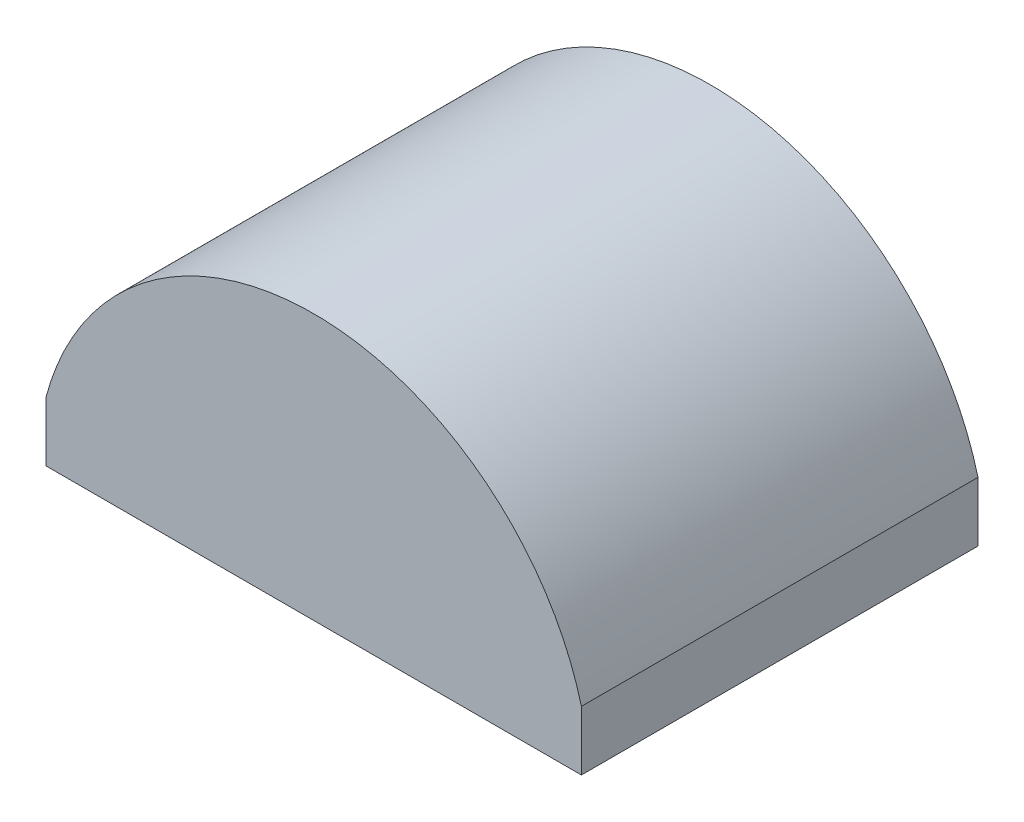
ISO-10303-21;
HEADER;
FILE_DESCRIPTION(('STEP AP214'),'2;1');
FILE_NAME('part.step','',(''),(''),'','','');
FILE_SCHEMA(('AUTOMOTIVE_DESIGN { 1 0 10303 214 1 1 1 1 }'));
ENDSEC;
DATA;
#1=APPLICATION_CONTEXT('core data for automotive mechanical design processes');
#2=APPLICATION_PROTOCOL_DEFINITION('international standard','automotive_design',2000,#1);
#3=PRODUCT_CONTEXT('',#1,'mechanical');
#4=PRODUCT('Part','Part','',(#3));
#5=PRODUCT_RELATED_PRODUCT_CATEGORY('part','',(#4));
#6=PRODUCT_DEFINITION_FORMATION('','',#4);
#7=PRODUCT_DEFINITION_CONTEXT('part definition',#1,'design');
#8=PRODUCT_DEFINITION('design','',#6,#7);
#9=PRODUCT_DEFINITION_SHAPE('','',#8);
#10=(LENGTH_UNIT() NAMED_UNIT(*) SI_UNIT(.MILLI.,.METRE.));
#11=(NAMED_UNIT(*) PLANE_ANGLE_UNIT() SI_UNIT($,.RADIAN.));
#12=(NAMED_UNIT(*) SI_UNIT($,.STERADIAN.) SOLID_ANGLE_UNIT());
#13=UNCERTAINTY_MEASURE_WITH_UNIT(LENGTH_MEASURE(1.E-05),#10,'distance_accuracy_value','');
#14=(GEOMETRIC_REPRESENTATION_CONTEXT(3) GLOBAL_UNCERTAINTY_ASSIGNED_CONTEXT((#13)) GLOBAL_UNIT_ASSIGNED_CONTEXT((#10,
#11,#12)) REPRESENTATION_CONTEXT('',''));
#15=CARTESIAN_POINT('',(0.,0.,0.));
#16=DIRECTION('',(0.,0.,1.));
#17=DIRECTION('',(1.,0.,0.));
#18=AXIS2_PLACEMENT_3D('',#15,#16,#17);
#19=CARTESIAN_POINT('',(0.,0.,10.));
#20=DIRECTION('',(1.,0.,0.));
#21=DIRECTION('',(0.,1.,0.));
#22=AXIS2_PLACEMENT_3D('',#19,#20,#21);
#23=PLANE('',#22);
#24=DIRECTION('',(0.,-1.,0.));
#25=VECTOR('',#24,1.);
#26=CARTESIAN_POINT('',(0.,0.,0.));
#27=LINE('',#26,#25);
#28=CARTESIAN_POINT('',(0.,2.,0.));
#29=VERTEX_POINT('',#28);
#30=CARTESIAN_POINT('',(0.,0.500000000000004,0.));
#31=VERTEX_POINT('',#30);
#32=EDGE_CURVE('E110',#29,#31,#27,.T.);
#33=ORIENTED_EDGE('',*,*,#32,.T.);
#34=DIRECTION('',(0.,0.,1.));
#35=VECTOR('',#34,1.);
#36=CARTESIAN_POINT('',(0.,0.500000000000004,10.));
#37=LINE('',#36,#35);
#38=CARTESIAN_POINT('',(0.,0.500000000000004,10.));
#39=VERTEX_POINT('',#38);
#40=EDGE_CURVE('E128',#31,#39,#37,.T.);
#41=ORIENTED_EDGE('',*,*,#40,.T.);
#42=DIRECTION('',(0.,-1.,0.));
#43=VECTOR('',#42,1.);
#44=CARTESIAN_POINT('',(0.,0.,10.));
#45=LINE('',#44,#43);
#46=CARTESIAN_POINT('',(0.,2.,10.));
#47=VERTEX_POINT('',#46);
#48=EDGE_CURVE('E92',#47,#39,#45,.T.);
#49=ORIENTED_EDGE('',*,*,#48,.F.);
#50=DIRECTION('',(0.,0.,-1.));
#51=VECTOR('',#50,1.);
#52=CARTESIAN_POINT('',(0.,2.,10.));
#53=LINE('',#52,#51);
#54=EDGE_CURVE('E101',#47,#29,#53,.T.);
#55=ORIENTED_EDGE('',*,*,#54,.T.);
#56=EDGE_LOOP('',(#33,#41,#49,#55));
#57=FACE_BOUND('',#56,.T.);
#58=ADVANCED_FACE('F33',(#57),#23,.F.);
#59=CARTESIAN_POINT('',(0.,0.,10.));
#60=DIRECTION('',(0.,1.,0.));
#61=DIRECTION('',(0.,0.,1.));
#62=AXIS2_PLACEMENT_3D('',#59,#60,#61);
#63=PLANE('',#62);
#64=DIRECTION('',(-1.,0.,0.));
#65=VECTOR('',#64,1.);
#66=CARTESIAN_POINT('',(0.,0.,9.5));
#67=LINE('',#66,#65);
#68=CARTESIAN_POINT('',(13.,0.,9.5));
#69=VERTEX_POINT('',#68);
#70=CARTESIAN_POINT('',(0.500000000000003,0.,9.5));
#71=VERTEX_POINT('',#70);
#72=EDGE_CURVE('E123',#69,#71,#67,.T.);
#73=ORIENTED_EDGE('',*,*,#72,.T.);
#74=DIRECTION('',(0.,0.,-1.));
#75=VECTOR('',#74,1.);
#76=CARTESIAN_POINT('',(0.500000000000003,0.,10.));
#77=LINE('',#76,#75);
#78=CARTESIAN_POINT('',(0.500000000000003,0.,0.500000000000002));
#79=VERTEX_POINT('',#78);
#80=EDGE_CURVE('E125',#71,#79,#77,.T.);
#81=ORIENTED_EDGE('',*,*,#80,.T.);
#82=DIRECTION('',(1.,0.,0.));
#83=VECTOR('',#82,1.);
#84=CARTESIAN_POINT('',(13.5,0.,0.500000000000002));
#85=LINE('',#84,#83);
#86=CARTESIAN_POINT('',(13.,0.,0.500000000000002));
#87=VERTEX_POINT('',#86);
#88=EDGE_CURVE('E119',#79,#87,#85,.T.);
#89=ORIENTED_EDGE('',*,*,#88,.T.);
#90=DIRECTION('',(0.,0.,1.));
#91=VECTOR('',#90,1.);
#92=CARTESIAN_POINT('',(13.,0.,10.));
#93=LINE('',#92,#91);
#94=EDGE_CURVE('E121',#87,#69,#93,.T.);
#95=ORIENTED_EDGE('',*,*,#94,.T.);
#96=EDGE_LOOP('',(#73,#81,#89,#95));
#97=FACE_BOUND('',#96,.T.);
#98=CARTESIAN_POINT('',(6.75,0.,5.));
#99=DIRECTION('',(0.,1.,0.));
#100=DIRECTION('',(0.,0.,1.));
#101=AXIS2_PLACEMENT_3D('',#98,#99,#100);
#102=CIRCLE('',#101,4.1);
#103=CARTESIAN_POINT('',(6.75,0.,9.1));
#104=VERTEX_POINT('',#103);
#105=EDGE_CURVE('E100',#104,#104,#102,.T.);
#106=ORIENTED_EDGE('',*,*,#105,.T.);
#107=EDGE_LOOP('',(#106));
#108=FACE_BOUND('',#107,.T.);
#109=ADVANCED_FACE('F162',(#97,#108),#63,.F.);
#110=CARTESIAN_POINT('',(13.5,0.,10.));
#111=DIRECTION('',(-1.,0.,0.));
#112=DIRECTION('',(0.,-1.,0.));
#113=AXIS2_PLACEMENT_3D('',#110,#111,#112);
#114=PLANE('',#113);
#115=DIRECTION('',(0.,1.,0.));
#116=VECTOR('',#115,1.);
#117=CARTESIAN_POINT('',(13.5,0.,10.));
#118=LINE('',#117,#116);
#119=CARTESIAN_POINT('',(13.5,0.500000000000003,10.));
#120=VERTEX_POINT('',#119);
#121=CARTESIAN_POINT('',(13.5,2.,10.));
#122=VERTEX_POINT('',#121);
#123=EDGE_CURVE('E86',#120,#122,#118,.T.);
#124=ORIENTED_EDGE('',*,*,#123,.F.);
#125=DIRECTION('',(0.,0.,-1.));
#126=VECTOR('',#125,1.);
#127=CARTESIAN_POINT('',(13.5,0.500000000000004,10.));
#128=LINE('',#127,#126);
#129=CARTESIAN_POINT('',(13.5,0.500000000000004,0.));
#130=VERTEX_POINT('',#129);
#131=EDGE_CURVE('E50',#120,#130,#128,.T.);
#132=ORIENTED_EDGE('',*,*,#131,.T.);
#133=DIRECTION('',(0.,1.,0.));
#134=VECTOR('',#133,1.);
#135=CARTESIAN_POINT('',(13.5,0.,0.));
#136=LINE('',#135,#134);
#137=CARTESIAN_POINT('',(13.5,2.,0.));
#138=VERTEX_POINT('',#137);
#139=EDGE_CURVE('E97',#130,#138,#136,.T.);
#140=ORIENTED_EDGE('',*,*,#139,.T.);
#141=DIRECTION('',(0.,0.,-1.));
#142=VECTOR('',#141,1.);
#143=CARTESIAN_POINT('',(13.5,2.,10.));
#144=LINE('',#143,#142);
#145=EDGE_CURVE('E95',#122,#138,#144,.T.);
#146=ORIENTED_EDGE('',*,*,#145,.F.);
#147=EDGE_LOOP('',(#124,#132,#140,#146));
#148=FACE_BOUND('',#147,.T.);
#149=ADVANCED_FACE('F96',(#148),#114,.F.);
#150=CARTESIAN_POINT('',(6.75,0.218990384615381,10.));
#151=DIRECTION('',(0.,0.,-1.));
#152=DIRECTION('',(-1.,0.,0.));
#153=AXIS2_PLACEMENT_3D('',#150,#151,#152);
#154=CYLINDRICAL_SURFACE('',#153,6.98100961538462);
#155=CARTESIAN_POINT('',(6.75,0.218990384615381,0.));
#156=DIRECTION('',(0.,0.,1.));
#157=DIRECTION('',(-1.,0.,0.));
#158=AXIS2_PLACEMENT_3D('',#155,#156,#157);
#159=CIRCLE('',#158,6.98100961538462);
#160=EDGE_CURVE('E115',#138,#29,#159,.T.);
#161=ORIENTED_EDGE('',*,*,#160,.T.);
#162=ORIENTED_EDGE('',*,*,#54,.F.);
#163=CARTESIAN_POINT('',(6.75,0.218990384615381,10.));
#164=DIRECTION('',(0.,0.,1.));
#165=DIRECTION('',(-1.,0.,0.));
#166=AXIS2_PLACEMENT_3D('',#163,#164,#165);
#167=CIRCLE('',#166,6.98100961538462);
#168=EDGE_CURVE('E90',#122,#47,#167,.T.);
#169=ORIENTED_EDGE('',*,*,#168,.F.);
#170=ORIENTED_EDGE('',*,*,#145,.T.);
#171=EDGE_LOOP('',(#161,#162,#169,#170));
#172=FACE_BOUND('',#171,.T.);
#173=ADVANCED_FACE('F103',(#172),#154,.T.);
#174=CARTESIAN_POINT('',(6.75,0.218990384615381,10.));
#175=DIRECTION('',(0.,0.,-1.));
#176=DIRECTION('',(-1.,0.,0.));
#177=AXIS2_PLACEMENT_3D('',#174,#175,#176);
#178=PLANE('',#177);
#179=ORIENTED_EDGE('',*,*,#48,.T.);
#180=DIRECTION('',(1.,0.,0.));
#181=VECTOR('',#180,1.);
#182=CARTESIAN_POINT('',(6.75,0.500000000000004,10.));
#183=LINE('',#182,#181);
#184=EDGE_CURVE('E58',#39,#120,#183,.T.);
#185=ORIENTED_EDGE('',*,*,#184,.T.);
#186=ORIENTED_EDGE('',*,*,#123,.T.);
#187=ORIENTED_EDGE('',*,*,#168,.T.);
#188=EDGE_LOOP('',(#179,#185,#186,#187));
#189=FACE_BOUND('',#188,.T.);
#190=ADVANCED_FACE('F88',(#189),#178,.F.);
#191=CARTESIAN_POINT('',(6.75,0.218990384615381,0.));
#192=DIRECTION('',(0.,0.,-1.));
#193=DIRECTION('',(-1.,0.,0.));
#194=AXIS2_PLACEMENT_3D('',#191,#192,#193);
#195=PLANE('',#194);
#196=ORIENTED_EDGE('',*,*,#139,.F.);
#197=DIRECTION('',(-1.,0.,0.));
#198=VECTOR('',#197,1.);
#199=CARTESIAN_POINT('',(0.,0.500000000000004,0.));
#200=LINE('',#199,#198);
#201=EDGE_CURVE('E42',#130,#31,#200,.T.);
#202=ORIENTED_EDGE('',*,*,#201,.T.);
#203=ORIENTED_EDGE('',*,*,#32,.F.);
#204=ORIENTED_EDGE('',*,*,#160,.F.);
#205=EDGE_LOOP('',(#196,#202,#203,#204));
#206=FACE_BOUND('',#205,.T.);
#207=ADVANCED_FACE('F197',(#206),#195,.T.);
#208=CARTESIAN_POINT('',(6.75,4.,5.));
#209=DIRECTION('',(0.,-1.,0.));
#210=DIRECTION('',(0.,0.,-1.));
#211=AXIS2_PLACEMENT_3D('',#208,#209,#210);
#212=CYLINDRICAL_SURFACE('',#211,3.6);
#213=CARTESIAN_POINT('',(6.75,0.499999999999994,5.));
#214=DIRECTION('',(0.,1.,0.));
#215=DIRECTION('',(0.,0.,1.));
#216=AXIS2_PLACEMENT_3D('',#213,#214,#215);
#217=CIRCLE('',#216,3.6);
#218=CARTESIAN_POINT('',(6.75,0.499999999999994,8.6));
#219=VERTEX_POINT('',#218);
#220=EDGE_CURVE('E11',#219,#219,#217,.F.);
#221=ORIENTED_EDGE('',*,*,#220,.T.);
#222=EDGE_LOOP('',(#221));
#223=FACE_BOUND('',#222,.T.);
#224=CARTESIAN_POINT('',(6.75,4.,5.));
#225=DIRECTION('',(0.,-1.,0.));
#226=DIRECTION('',(0.,0.,-1.));
#227=AXIS2_PLACEMENT_3D('',#224,#225,#226);
#228=CIRCLE('',#227,3.6);
#229=CARTESIAN_POINT('',(6.75,4.,1.4));
#230=VERTEX_POINT('',#229);
#231=EDGE_CURVE('E113',#230,#230,#228,.T.);
#232=ORIENTED_EDGE('',*,*,#231,.F.);
#233=EDGE_LOOP('',(#232));
#234=FACE_BOUND('',#233,.T.);
#235=ADVANCED_FACE('F194',(#223,#234),#212,.F.);
#236=CARTESIAN_POINT('',(6.75,4.,5.));
#237=DIRECTION('',(0.,-1.,0.));
#238=DIRECTION('',(0.,0.,-1.));
#239=AXIS2_PLACEMENT_3D('',#236,#237,#238);
#240=PLANE('',#239);
#241=ORIENTED_EDGE('',*,*,#231,.T.);
#242=EDGE_LOOP('',(#241));
#243=FACE_BOUND('',#242,.T.);
#244=ADVANCED_FACE('F173',(#243),#240,.T.);
#245=CARTESIAN_POINT('',(13.5,0.500000000000003,10.));
#246=DIRECTION('',(-0.707106781186548,0.707106781186547,0.));
#247=DIRECTION('',(0.,0.,-1.));
#248=AXIS2_PLACEMENT_3D('',#245,#246,#247);
#249=PLANE('',#248);
#250=DIRECTION('',(0.577350269189625,0.577350269189627,-0.577350269189625));
#251=VECTOR('',#250,1.);
#252=CARTESIAN_POINT('',(8.66666666666667,-4.33333333333334,4.83333333333333));
#253=LINE('',#252,#251);
#254=EDGE_CURVE('E137',#130,#87,#253,.F.);
#255=ORIENTED_EDGE('',*,*,#254,.F.);
#256=ORIENTED_EDGE('',*,*,#131,.F.);
#257=DIRECTION('',(-0.577350269189625,-0.577350269189627,-0.577350269189625));
#258=VECTOR('',#257,1.);
#259=CARTESIAN_POINT('',(13.5,0.500000000000004,10.));
#260=LINE('',#259,#258);
#261=EDGE_CURVE('E37',#69,#120,#260,.F.);
#262=ORIENTED_EDGE('',*,*,#261,.F.);
#263=ORIENTED_EDGE('',*,*,#94,.F.);
#264=EDGE_LOOP('',(#255,#256,#262,#263));
#265=FACE_BOUND('',#264,.T.);
#266=ADVANCED_FACE('F166',(#265),#249,.F.);
#267=CARTESIAN_POINT('',(6.75,0.500000000000004,10.));
#268=DIRECTION('',(0.,0.707106781186546,-0.707106781186549));
#269=DIRECTION('',(1.,0.,0.));
#270=AXIS2_PLACEMENT_3D('',#267,#268,#269);
#271=PLANE('',#270);
#272=ORIENTED_EDGE('',*,*,#261,.T.);
#273=ORIENTED_EDGE('',*,*,#184,.F.);
#274=DIRECTION('',(0.577350269189625,-0.577350269189627,-0.577350269189625));
#275=VECTOR('',#274,1.);
#276=CARTESIAN_POINT('',(2.24999999999999,-1.75,7.75000000000001));
#277=LINE('',#276,#275);
#278=EDGE_CURVE('E136',#71,#39,#277,.F.);
#279=ORIENTED_EDGE('',*,*,#278,.F.);
#280=ORIENTED_EDGE('',*,*,#72,.F.);
#281=EDGE_LOOP('',(#272,#273,#279,#280));
#282=FACE_BOUND('',#281,.T.);
#283=ADVANCED_FACE('F164',(#282),#271,.F.);
#284=CARTESIAN_POINT('',(0.,0.,0.500000000000002));
#285=DIRECTION('',(0.,-0.707106781186546,-0.707106781186549));
#286=DIRECTION('',(-1.,0.,0.));
#287=AXIS2_PLACEMENT_3D('',#284,#285,#286);
#288=PLANE('',#287);
#289=ORIENTED_EDGE('',*,*,#254,.T.);
#290=ORIENTED_EDGE('',*,*,#88,.F.);
#291=DIRECTION('',(0.577350269189625,-0.577350269189627,0.577350269189625));
#292=VECTOR('',#291,1.);
#293=CARTESIAN_POINT('',(0.333333333333336,0.166666666666668,0.333333333333335));
#294=LINE('',#293,#292);
#295=EDGE_CURVE('E134',#31,#79,#294,.T.);
#296=ORIENTED_EDGE('',*,*,#295,.F.);
#297=ORIENTED_EDGE('',*,*,#201,.F.);
#298=EDGE_LOOP('',(#289,#290,#296,#297));
#299=FACE_BOUND('',#298,.T.);
#300=ADVANCED_FACE('F159',(#299),#288,.T.);
#301=CARTESIAN_POINT('',(0.500000000000003,0.,10.));
#302=DIRECTION('',(0.707106781186549,0.707106781186546,0.));
#303=DIRECTION('',(0.,0.,-1.));
#304=AXIS2_PLACEMENT_3D('',#301,#302,#303);
#305=PLANE('',#304);
#306=ORIENTED_EDGE('',*,*,#278,.T.);
#307=ORIENTED_EDGE('',*,*,#40,.F.);
#308=ORIENTED_EDGE('',*,*,#295,.T.);
#309=ORIENTED_EDGE('',*,*,#80,.F.);
#310=EDGE_LOOP('',(#306,#307,#308,#309));
#311=FACE_BOUND('',#310,.T.);
#312=ADVANCED_FACE('F156',(#311),#305,.F.);
#313=CARTESIAN_POINT('',(6.75,0.499999999999994,5.));
#314=DIRECTION('',(0.,-1.,0.));
#315=DIRECTION('',(0.,0.,-1.));
#316=AXIS2_PLACEMENT_3D('',#313,#314,#315);
#317=CONICAL_SURFACE('',#316,3.6,0.78539816339745);
#318=ORIENTED_EDGE('',*,*,#105,.F.);
#319=EDGE_LOOP('',(#318));
#320=FACE_BOUND('',#319,.T.);
#321=ORIENTED_EDGE('',*,*,#220,.F.);
#322=EDGE_LOOP('',(#321));
#323=FACE_BOUND('',#322,.T.);
#324=ADVANCED_FACE('F35',(#320,#323),#317,.F.);
#325=CLOSED_SHELL('',(#58,#109,#149,#173,#190,#207,#235,#244,#266,#283,#300,#312,#324));
#326=MANIFOLD_SOLID_BREP('B2',#325);
#327=ADVANCED_BREP_SHAPE_REPRESENTATION('',(#18,#326),#14);
#328=SHAPE_DEFINITION_REPRESENTATION(#9,#327);
ENDSEC;
END-ISO-10303-21;
